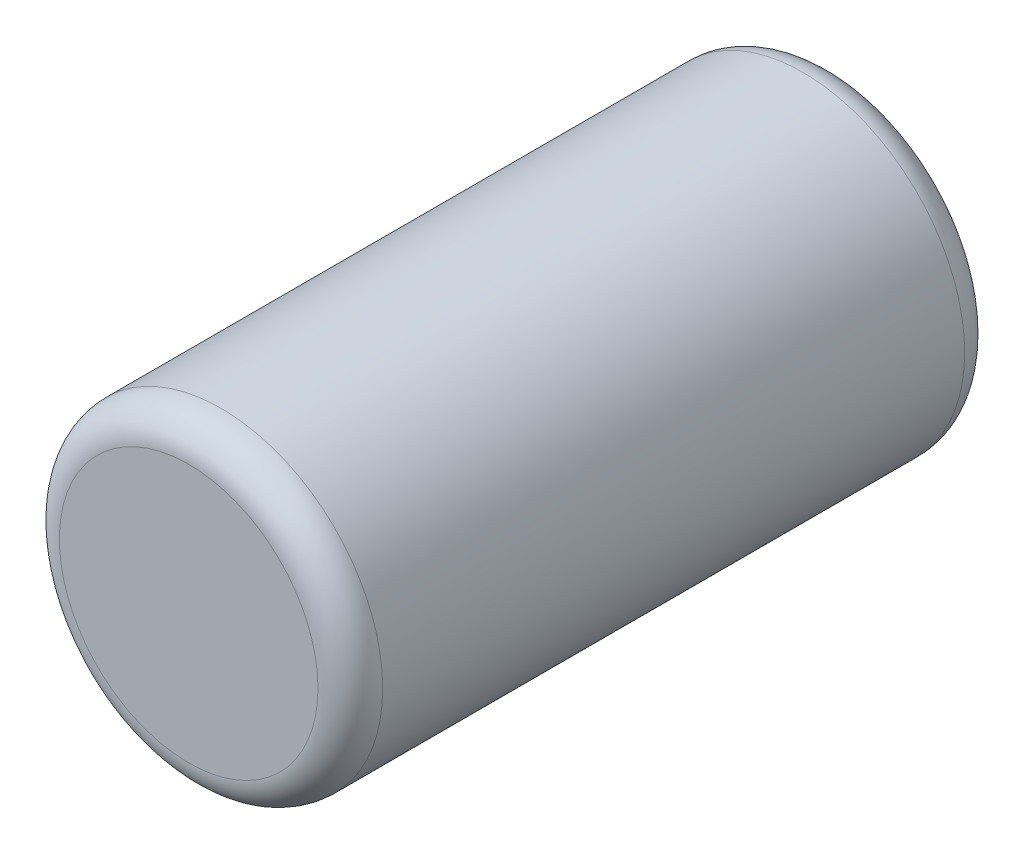
ISO-10303-21;
HEADER;
FILE_DESCRIPTION(('STEP AP214'),'2;1');
FILE_NAME('part.step','',(''),(''),'','','');
FILE_SCHEMA(('AUTOMOTIVE_DESIGN { 1 0 10303 214 1 1 1 1 }'));
ENDSEC;
DATA;
#1=APPLICATION_CONTEXT('core data for automotive mechanical design processes');
#2=APPLICATION_PROTOCOL_DEFINITION('international standard','automotive_design',2000,#1);
#3=PRODUCT_CONTEXT('',#1,'mechanical');
#4=PRODUCT('Part','Part','',(#3));
#5=PRODUCT_RELATED_PRODUCT_CATEGORY('part','',(#4));
#6=PRODUCT_DEFINITION_FORMATION('','',#4);
#7=PRODUCT_DEFINITION_CONTEXT('part definition',#1,'design');
#8=PRODUCT_DEFINITION('design','',#6,#7);
#9=PRODUCT_DEFINITION_SHAPE('','',#8);
#10=(LENGTH_UNIT() NAMED_UNIT(*) SI_UNIT(.MILLI.,.METRE.));
#11=(NAMED_UNIT(*) PLANE_ANGLE_UNIT() SI_UNIT($,.RADIAN.));
#12=(NAMED_UNIT(*) SI_UNIT($,.STERADIAN.) SOLID_ANGLE_UNIT());
#13=UNCERTAINTY_MEASURE_WITH_UNIT(LENGTH_MEASURE(1.E-05),#10,'distance_accuracy_value','');
#14=(GEOMETRIC_REPRESENTATION_CONTEXT(3) GLOBAL_UNCERTAINTY_ASSIGNED_CONTEXT((#13)) GLOBAL_UNIT_ASSIGNED_CONTEXT((#10,
#11,#12)) REPRESENTATION_CONTEXT('',''));
#15=CARTESIAN_POINT('',(0.,0.,0.));
#16=DIRECTION('',(0.,0.,1.));
#17=DIRECTION('',(1.,0.,0.));
#18=AXIS2_PLACEMENT_3D('',#15,#16,#17);
#19=CARTESIAN_POINT('',(0.,0.,3.));
#20=DIRECTION('',(0.,0.,-1.));
#21=DIRECTION('',(-1.,0.,0.));
#22=AXIS2_PLACEMENT_3D('',#19,#20,#21);
#23=CYLINDRICAL_SURFACE('',#22,1.5);
#24=CARTESIAN_POINT('',(0.,0.,-2.7));
#25=DIRECTION('',(0.,0.,1.));
#26=DIRECTION('',(1.,0.,0.));
#27=AXIS2_PLACEMENT_3D('',#24,#25,#26);
#28=CIRCLE('',#27,1.5);
#29=CARTESIAN_POINT('',(1.50000000000001,0.,-2.7));
#30=VERTEX_POINT('',#29);
#31=EDGE_CURVE('E40',#30,#30,#28,.T.);
#32=ORIENTED_EDGE('',*,*,#31,.T.);
#33=EDGE_LOOP('',(#32));
#34=FACE_BOUND('',#33,.T.);
#35=CARTESIAN_POINT('',(0.,0.,2.69999999999999));
#36=DIRECTION('',(0.,0.,1.));
#37=DIRECTION('',(1.,0.,0.));
#38=AXIS2_PLACEMENT_3D('',#35,#36,#37);
#39=CIRCLE('',#38,1.5);
#40=CARTESIAN_POINT('',(1.50000000000001,0.,2.69999999999999));
#41=VERTEX_POINT('',#40);
#42=EDGE_CURVE('E44',#41,#41,#39,.F.);
#43=ORIENTED_EDGE('',*,*,#42,.T.);
#44=EDGE_LOOP('',(#43));
#45=FACE_BOUND('',#44,.T.);
#46=ADVANCED_FACE('F33',(#34,#45),#23,.T.);
#47=CARTESIAN_POINT('',(0.,0.,3.));
#48=DIRECTION('',(0.,0.,1.));
#49=DIRECTION('',(1.,0.,0.));
#50=AXIS2_PLACEMENT_3D('',#47,#48,#49);
#51=PLANE('',#50);
#52=CARTESIAN_POINT('',(0.,0.,3.));
#53=DIRECTION('',(0.,0.,1.));
#54=DIRECTION('',(1.,0.,0.));
#55=AXIS2_PLACEMENT_3D('',#52,#53,#54);
#56=CIRCLE('',#55,1.2);
#57=CARTESIAN_POINT('',(1.2,0.,3.));
#58=VERTEX_POINT('',#57);
#59=EDGE_CURVE('E48',#58,#58,#56,.T.);
#60=ORIENTED_EDGE('',*,*,#59,.T.);
#61=EDGE_LOOP('',(#60));
#62=FACE_BOUND('',#61,.T.);
#63=ADVANCED_FACE('F54',(#62),#51,.T.);
#64=CARTESIAN_POINT('',(0.,0.,-3.00000000000001));
#65=DIRECTION('',(0.,0.,1.));
#66=DIRECTION('',(1.,0.,0.));
#67=AXIS2_PLACEMENT_3D('',#64,#65,#66);
#68=PLANE('',#67);
#69=CARTESIAN_POINT('',(0.,0.,-3.00000000000001));
#70=DIRECTION('',(0.,0.,1.));
#71=DIRECTION('',(1.,0.,0.));
#72=AXIS2_PLACEMENT_3D('',#69,#70,#71);
#73=CIRCLE('',#72,1.2);
#74=CARTESIAN_POINT('',(1.20000000000001,0.,-3.00000000000001));
#75=VERTEX_POINT('',#74);
#76=EDGE_CURVE('E10',#75,#75,#73,.F.);
#77=ORIENTED_EDGE('',*,*,#76,.T.);
#78=EDGE_LOOP('',(#77));
#79=FACE_BOUND('',#78,.T.);
#80=ADVANCED_FACE('F58',(#79),#68,.F.);
#81=CARTESIAN_POINT('',(0.,0.,2.69999999999999));
#82=DIRECTION('',(0.,0.,1.));
#83=DIRECTION('',(1.,0.,0.));
#84=AXIS2_PLACEMENT_3D('',#81,#82,#83);
#85=TOROIDAL_SURFACE('',#84,1.2,0.3);
#86=ORIENTED_EDGE('',*,*,#42,.F.);
#87=EDGE_LOOP('',(#86));
#88=FACE_BOUND('',#87,.T.);
#89=ORIENTED_EDGE('',*,*,#59,.F.);
#90=EDGE_LOOP('',(#89));
#91=FACE_BOUND('',#90,.T.);
#92=ADVANCED_FACE('F56',(#88,#91),#85,.T.);
#93=CARTESIAN_POINT('',(0.,0.,-2.7));
#94=DIRECTION('',(0.,0.,1.));
#95=DIRECTION('',(1.,0.,0.));
#96=AXIS2_PLACEMENT_3D('',#93,#94,#95);
#97=TOROIDAL_SURFACE('',#96,1.2,0.3);
#98=ORIENTED_EDGE('',*,*,#76,.F.);
#99=EDGE_LOOP('',(#98));
#100=FACE_BOUND('',#99,.T.);
#101=ORIENTED_EDGE('',*,*,#31,.F.);
#102=EDGE_LOOP('',(#101));
#103=FACE_BOUND('',#102,.T.);
#104=ADVANCED_FACE('F35',(#100,#103),#97,.T.);
#105=CLOSED_SHELL('',(#46,#63,#80,#92,#104));
#106=MANIFOLD_SOLID_BREP('B2',#105);
#107=ADVANCED_BREP_SHAPE_REPRESENTATION('',(#18,#106),#14);
#108=SHAPE_DEFINITION_REPRESENTATION(#9,#107);
ENDSEC;
END-ISO-10303-21;
